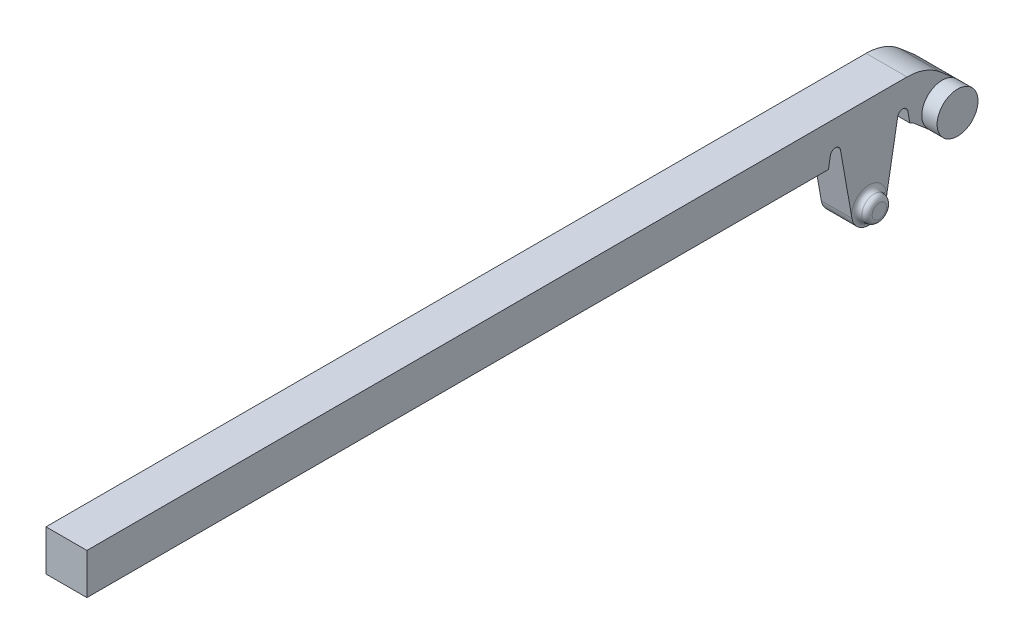
ISO-10303-21;
HEADER;
FILE_DESCRIPTION(('STEP AP214'),'2;1');
FILE_NAME('part.step','',(''),(''),'','','');
FILE_SCHEMA(('AUTOMOTIVE_DESIGN { 1 0 10303 214 1 1 1 1 }'));
ENDSEC;
DATA;
#1=APPLICATION_CONTEXT('core data for automotive mechanical design processes');
#2=APPLICATION_PROTOCOL_DEFINITION('international standard','automotive_design',2000,#1);
#3=PRODUCT_CONTEXT('',#1,'mechanical');
#4=PRODUCT('Part','Part','',(#3));
#5=PRODUCT_RELATED_PRODUCT_CATEGORY('part','',(#4));
#6=PRODUCT_DEFINITION_FORMATION('','',#4);
#7=PRODUCT_DEFINITION_CONTEXT('part definition',#1,'design');
#8=PRODUCT_DEFINITION('design','',#6,#7);
#9=PRODUCT_DEFINITION_SHAPE('','',#8);
#10=(LENGTH_UNIT() NAMED_UNIT(*) SI_UNIT(.MILLI.,.METRE.));
#11=(NAMED_UNIT(*) PLANE_ANGLE_UNIT() SI_UNIT($,.RADIAN.));
#12=(NAMED_UNIT(*) SI_UNIT($,.STERADIAN.) SOLID_ANGLE_UNIT());
#13=UNCERTAINTY_MEASURE_WITH_UNIT(LENGTH_MEASURE(1.E-05),#10,'distance_accuracy_value','');
#14=(GEOMETRIC_REPRESENTATION_CONTEXT(3) GLOBAL_UNCERTAINTY_ASSIGNED_CONTEXT((#13)) GLOBAL_UNIT_ASSIGNED_CONTEXT((#10,
#11,#12)) REPRESENTATION_CONTEXT('',''));
#15=CARTESIAN_POINT('',(0.,0.,0.));
#16=DIRECTION('',(0.,0.,1.));
#17=DIRECTION('',(1.,0.,0.));
#18=AXIS2_PLACEMENT_3D('',#15,#16,#17);
#19=CARTESIAN_POINT('',(28.25,4.75,-19.2260630484056));
#20=DIRECTION('',(-1.,0.,0.));
#21=DIRECTION('',(0.,0.,1.));
#22=AXIS2_PLACEMENT_3D('',#19,#20,#21);
#23=PLANE('',#22);
#24=DIRECTION('',(0.,-0.984807753012209,-0.173648177666924));
#25=VECTOR('',#24,1.);
#26=CARTESIAN_POINT('',(28.25,4.75,-14.346069928126));
#27=LINE('',#26,#25);
#28=CARTESIAN_POINT('',(28.25,5.29341204441673,-14.2502517230534));
#29=VERTEX_POINT('',#28);
#30=CARTESIAN_POINT('',(28.25,2.10239904898312,-14.8129134099396));
#31=VERTEX_POINT('',#30);
#32=EDGE_CURVE('E235',#29,#31,#27,.T.);
#33=ORIENTED_EDGE('',*,*,#32,.T.);
#34=CARTESIAN_POINT('',(28.25,2.25,-15.65));
#35=DIRECTION('',(-1.,0.,0.));
#36=DIRECTION('',(0.,0.,1.));
#37=AXIS2_PLACEMENT_3D('',#34,#35,#36);
#38=CIRCLE('',#37,0.85);
#39=CARTESIAN_POINT('',(28.25,2.10239904898312,-16.4870865900604));
#40=VERTEX_POINT('',#39);
#41=EDGE_CURVE('E167',#31,#40,#38,.T.);
#42=ORIENTED_EDGE('',*,*,#41,.T.);
#43=DIRECTION('',(0.,0.984807753012209,-0.173648177666924));
#44=VECTOR('',#43,1.);
#45=CARTESIAN_POINT('',(28.25,2.10239904898312,-16.4870865900604));
#46=LINE('',#45,#44);
#47=CARTESIAN_POINT('',(28.25,5.29341204441673,-17.0497482769466));
#48=VERTEX_POINT('',#47);
#49=EDGE_CURVE('E223',#40,#48,#46,.T.);
#50=ORIENTED_EDGE('',*,*,#49,.T.);
#51=CARTESIAN_POINT('',(28.25,5.25,-17.2959502151997));
#52=DIRECTION('',(1.,0.,0.));
#53=DIRECTION('',(0.,0.,-1.));
#54=AXIS2_PLACEMENT_3D('',#51,#52,#53);
#55=CIRCLE('',#54,0.250000000000004);
#56=CARTESIAN_POINT('',(28.25,5.29341204441673,-17.5421521534528));
#57=VERTEX_POINT('',#56);
#58=EDGE_CURVE('E359',#57,#48,#55,.T.);
#59=ORIENTED_EDGE('',*,*,#58,.F.);
#60=DIRECTION('',(0.,0.984807753012209,0.173648177666924));
#61=VECTOR('',#60,1.);
#62=CARTESIAN_POINT('',(28.25,5.29341204441673,-17.5421521534528));
#63=LINE('',#62,#61);
#64=CARTESIAN_POINT('',(28.25,4.73082718370005,-17.6413510433352));
#65=VERTEX_POINT('',#64);
#66=EDGE_CURVE('E177',#65,#57,#63,.T.);
#67=ORIENTED_EDGE('',*,*,#66,.F.);
#68=CARTESIAN_POINT('',(28.25,4.25,-17.5042189193997));
#69=DIRECTION('',(-1.,0.,0.));
#70=DIRECTION('',(0.,0.,1.));
#71=AXIS2_PLACEMENT_3D('',#68,#69,#70);
#72=CIRCLE('',#71,0.5);
#73=CARTESIAN_POINT('',(28.25,4.62969111772034,-17.8295413058477));
#74=VERTEX_POINT('',#73);
#75=EDGE_CURVE('E303',#65,#74,#72,.T.);
#76=ORIENTED_EDGE('',*,*,#75,.T.);
#77=DIRECTION('',(0.,0.650644772896171,0.759382235440684));
#78=VECTOR('',#77,1.);
#79=CARTESIAN_POINT('',(28.25,3.99061776455932,-18.5754182755094));
#80=LINE('',#79,#78);
#81=CARTESIAN_POINT('',(28.25,3.99061776455932,-18.5754182755094));
#82=VERTEX_POINT('',#81);
#83=EDGE_CURVE('E243',#82,#74,#80,.T.);
#84=ORIENTED_EDGE('',*,*,#83,.F.);
#85=CARTESIAN_POINT('',(28.25,4.75,-19.2260630484056));
#86=DIRECTION('',(-1.,0.,0.));
#87=DIRECTION('',(0.,0.,1.));
#88=AXIS2_PLACEMENT_3D('',#85,#86,#87);
#89=CIRCLE('',#88,1.);
#90=CARTESIAN_POINT('',(28.25,5.50938223544068,-19.8767078213017));
#91=VERTEX_POINT('',#90);
#92=EDGE_CURVE('E279',#82,#91,#89,.T.);
#93=ORIENTED_EDGE('',*,*,#92,.T.);
#94=DIRECTION('',(0.,-0.650644772896172,-0.759382235440683));
#95=VECTOR('',#94,1.);
#96=CARTESIAN_POINT('',(28.25,5.50938223544068,-19.8767078213017));
#97=LINE('',#96,#95);
#98=CARTESIAN_POINT('',(28.25,6.1484555886017,-19.1308308516401));
#99=VERTEX_POINT('',#98);
#100=EDGE_CURVE('E249',#99,#91,#97,.T.);
#101=ORIENTED_EDGE('',*,*,#100,.F.);
#102=CARTESIAN_POINT('',(28.25,4.25,-17.5042189193997));
#103=DIRECTION('',(-1.,0.,0.));
#104=DIRECTION('',(0.,0.,1.));
#105=AXIS2_PLACEMENT_3D('',#102,#103,#104);
#106=CIRCLE('',#105,2.5);
#107=CARTESIAN_POINT('',(28.25,6.75,-17.5042189193997));
#108=VERTEX_POINT('',#107);
#109=EDGE_CURVE('E295',#99,#108,#106,.F.);
#110=ORIENTED_EDGE('',*,*,#109,.T.);
#111=DIRECTION('',(0.,0.,-1.));
#112=VECTOR('',#111,1.);
#113=CARTESIAN_POINT('',(28.25,6.75,22.6));
#114=LINE('',#113,#112);
#115=CARTESIAN_POINT('',(28.25,6.75,22.6));
#116=VERTEX_POINT('',#115);
#117=EDGE_CURVE('E266',#116,#108,#114,.T.);
#118=ORIENTED_EDGE('',*,*,#117,.F.);
#119=DIRECTION('',(0.,1.,0.));
#120=VECTOR('',#119,1.);
#121=CARTESIAN_POINT('',(28.25,4.75,22.6));
#122=LINE('',#121,#120);
#123=CARTESIAN_POINT('',(28.25,4.75,22.6));
#124=VERTEX_POINT('',#123);
#125=EDGE_CURVE('E264',#124,#116,#122,.T.);
#126=ORIENTED_EDGE('',*,*,#125,.F.);
#127=DIRECTION('',(0.,0.,1.));
#128=VECTOR('',#127,1.);
#129=CARTESIAN_POINT('',(28.25,4.75,-17.6891260873219));
#130=LINE('',#129,#128);
#131=CARTESIAN_POINT('',(28.25,4.75,-13.6620296414746));
#132=VERTEX_POINT('',#131);
#133=EDGE_CURVE('E262',#132,#124,#130,.T.);
#134=ORIENTED_EDGE('',*,*,#133,.F.);
#135=DIRECTION('',(0.,-0.984807753012209,0.173648177666923));
#136=VECTOR('',#135,1.);
#137=CARTESIAN_POINT('',(28.25,5.29341204441673,-13.7578478465473));
#138=LINE('',#137,#136);
#139=CARTESIAN_POINT('',(28.25,5.29341204441673,-13.7578478465473));
#140=VERTEX_POINT('',#139);
#141=EDGE_CURVE('E369',#140,#132,#138,.T.);
#142=ORIENTED_EDGE('',*,*,#141,.F.);
#143=CARTESIAN_POINT('',(28.25,5.25,-14.0040497848003));
#144=DIRECTION('',(1.,0.,0.));
#145=DIRECTION('',(0.,0.,1.));
#146=AXIS2_PLACEMENT_3D('',#143,#144,#145);
#147=CIRCLE('',#146,0.250000000000004);
#148=EDGE_CURVE('E367',#29,#140,#147,.T.);
#149=ORIENTED_EDGE('',*,*,#148,.F.);
#150=EDGE_LOOP('',(#33,#42,#50,#59,#67,#76,#84,#93,#101,#110,#118,#126,#134,#142,#149));
#151=FACE_BOUND('',#150,.T.);
#152=ADVANCED_FACE('F35',(#151),#23,.F.);
#153=CARTESIAN_POINT('',(26.25,4.75,-19.2260630484056));
#154=DIRECTION('',(-1.,0.,0.));
#155=DIRECTION('',(0.,0.,1.));
#156=AXIS2_PLACEMENT_3D('',#153,#154,#155);
#157=PLANE('',#156);
#158=CARTESIAN_POINT('',(26.25,5.25,-17.2959502151997));
#159=DIRECTION('',(1.,0.,0.));
#160=DIRECTION('',(0.,0.,-1.));
#161=AXIS2_PLACEMENT_3D('',#158,#159,#160);
#162=CIRCLE('',#161,0.250000000000004);
#163=CARTESIAN_POINT('',(26.25,5.5,-17.2959502151997));
#164=VERTEX_POINT('',#163);
#165=CARTESIAN_POINT('',(26.25,5.29341204441673,-17.5421521534528));
#166=VERTEX_POINT('',#165);
#167=EDGE_CURVE('E161',#164,#166,#162,.F.);
#168=ORIENTED_EDGE('',*,*,#167,.F.);
#169=DIRECTION('',(0.,0.,1.));
#170=VECTOR('',#169,1.);
#171=CARTESIAN_POINT('',(26.25,5.5,-19.2260630484056));
#172=LINE('',#171,#170);
#173=CARTESIAN_POINT('',(26.25,5.50000000000001,-14.0040497848003));
#174=VERTEX_POINT('',#173);
#175=EDGE_CURVE('E170',#164,#174,#172,.T.);
#176=ORIENTED_EDGE('',*,*,#175,.T.);
#177=CARTESIAN_POINT('',(26.25,5.25,-14.0040497848003));
#178=DIRECTION('',(1.,0.,0.));
#179=DIRECTION('',(0.,0.,-1.));
#180=AXIS2_PLACEMENT_3D('',#177,#178,#179);
#181=CIRCLE('',#180,0.250000000000004);
#182=CARTESIAN_POINT('',(26.25,5.29341204441673,-13.7578478465472));
#183=VERTEX_POINT('',#182);
#184=EDGE_CURVE('E186',#183,#174,#181,.F.);
#185=ORIENTED_EDGE('',*,*,#184,.F.);
#186=DIRECTION('',(0.,0.984807753012209,-0.173648177666924));
#187=VECTOR('',#186,1.);
#188=CARTESIAN_POINT('',(26.25,5.70150575165363,-13.8298057777905));
#189=LINE('',#188,#187);
#190=CARTESIAN_POINT('',(26.25,4.75,-13.6620296414746));
#191=VERTEX_POINT('',#190);
#192=EDGE_CURVE('E307',#191,#183,#189,.T.);
#193=ORIENTED_EDGE('',*,*,#192,.F.);
#194=DIRECTION('',(0.,0.,1.));
#195=VECTOR('',#194,1.);
#196=CARTESIAN_POINT('',(26.25,4.75,-17.6891260873219));
#197=LINE('',#196,#195);
#198=CARTESIAN_POINT('',(26.25,4.75,22.6));
#199=VERTEX_POINT('',#198);
#200=EDGE_CURVE('E252',#191,#199,#197,.T.);
#201=ORIENTED_EDGE('',*,*,#200,.T.);
#202=DIRECTION('',(0.,1.,0.));
#203=VECTOR('',#202,1.);
#204=CARTESIAN_POINT('',(26.25,4.75,22.6));
#205=LINE('',#204,#203);
#206=CARTESIAN_POINT('',(26.25,6.75,22.6));
#207=VERTEX_POINT('',#206);
#208=EDGE_CURVE('E254',#199,#207,#205,.T.);
#209=ORIENTED_EDGE('',*,*,#208,.T.);
#210=DIRECTION('',(0.,0.,-1.));
#211=VECTOR('',#210,1.);
#212=CARTESIAN_POINT('',(26.25,6.75,22.6));
#213=LINE('',#212,#211);
#214=CARTESIAN_POINT('',(26.25,6.75,-17.5042189193997));
#215=VERTEX_POINT('',#214);
#216=EDGE_CURVE('E256',#207,#215,#213,.T.);
#217=ORIENTED_EDGE('',*,*,#216,.T.);
#218=CARTESIAN_POINT('',(26.25,4.25,-17.5042189193997));
#219=DIRECTION('',(-1.,0.,0.));
#220=DIRECTION('',(0.,0.,1.));
#221=AXIS2_PLACEMENT_3D('',#218,#219,#220);
#222=CIRCLE('',#221,2.5);
#223=CARTESIAN_POINT('',(26.25,6.1484555886017,-19.1308308516401));
#224=VERTEX_POINT('',#223);
#225=EDGE_CURVE('E299',#215,#224,#222,.T.);
#226=ORIENTED_EDGE('',*,*,#225,.T.);
#227=DIRECTION('',(0.,-0.650644772896172,-0.759382235440683));
#228=VECTOR('',#227,1.);
#229=CARTESIAN_POINT('',(26.25,5.50938223544068,-19.8767078213017));
#230=LINE('',#229,#228);
#231=CARTESIAN_POINT('',(26.25,5.50938223544068,-19.8767078213017));
#232=VERTEX_POINT('',#231);
#233=EDGE_CURVE('E259',#224,#232,#230,.T.);
#234=ORIENTED_EDGE('',*,*,#233,.T.);
#235=CARTESIAN_POINT('',(26.25,4.75,-19.2260630484056));
#236=DIRECTION('',(-1.,0.,0.));
#237=DIRECTION('',(0.,0.,1.));
#238=AXIS2_PLACEMENT_3D('',#235,#236,#237);
#239=CIRCLE('',#238,1.);
#240=CARTESIAN_POINT('',(26.25,3.99061776455932,-18.5754182755094));
#241=VERTEX_POINT('',#240);
#242=EDGE_CURVE('E245',#232,#241,#239,.T.);
#243=ORIENTED_EDGE('',*,*,#242,.T.);
#244=DIRECTION('',(0.,0.650644772896171,0.759382235440684));
#245=VECTOR('',#244,1.);
#246=CARTESIAN_POINT('',(26.25,3.99061776455932,-18.5754182755094));
#247=LINE('',#246,#245);
#248=CARTESIAN_POINT('',(26.25,4.62969111772034,-17.8295413058477));
#249=VERTEX_POINT('',#248);
#250=EDGE_CURVE('E248',#241,#249,#247,.T.);
#251=ORIENTED_EDGE('',*,*,#250,.T.);
#252=CARTESIAN_POINT('',(26.25,4.25,-17.5042189193997));
#253=DIRECTION('',(-1.,0.,0.));
#254=DIRECTION('',(0.,0.,1.));
#255=AXIS2_PLACEMENT_3D('',#252,#253,#254);
#256=CIRCLE('',#255,0.5);
#257=CARTESIAN_POINT('',(26.25,4.73082718370005,-17.6413510433352));
#258=VERTEX_POINT('',#257);
#259=EDGE_CURVE('E305',#249,#258,#256,.F.);
#260=ORIENTED_EDGE('',*,*,#259,.T.);
#261=DIRECTION('',(0.,-0.984807753012209,-0.173648177666924));
#262=VECTOR('',#261,1.);
#263=CARTESIAN_POINT('',(26.25,5.29341204441673,-17.5421521534528));
#264=LINE('',#263,#262);
#265=EDGE_CURVE('E182',#258,#166,#264,.F.);
#266=ORIENTED_EDGE('',*,*,#265,.T.);
#267=EDGE_LOOP('',(#168,#176,#185,#193,#201,#209,#217,#226,#234,#243,#251,#260,#266));
#268=FACE_BOUND('',#267,.T.);
#269=ADVANCED_FACE('F180',(#268),#157,.T.);
#270=CARTESIAN_POINT('',(26.249975,5.25,-14.0040497848003));
#271=DIRECTION('',(1.,0.,0.));
#272=DIRECTION('',(0.,0.,-1.));
#273=AXIS2_PLACEMENT_3D('',#270,#271,#272);
#274=CYLINDRICAL_SURFACE('',#273,0.250000000000004);
#275=DIRECTION('',(1.,0.,0.));
#276=VECTOR('',#275,1.);
#277=CARTESIAN_POINT('',(26.249975,5.50000000000001,-14.0040497848003));
#278=LINE('',#277,#276);
#279=CARTESIAN_POINT('',(26.5,5.50000000000001,-14.0040497848003));
#280=VERTEX_POINT('',#279);
#281=EDGE_CURVE('E173',#174,#280,#278,.T.);
#282=ORIENTED_EDGE('',*,*,#281,.T.);
#283=CARTESIAN_POINT('',(26.5,5.25,-14.0040497848003));
#284=DIRECTION('',(0.707106781186548,0.,0.707106781186547));
#285=DIRECTION('',(0.707106781186547,0.,-0.707106781186548));
#286=AXIS2_PLACEMENT_3D('',#283,#284,#285);
#287=ELLIPSE('',#286,0.353553390593277,0.250000000000002);
#288=CARTESIAN_POINT('',(26.746201938253,5.29341204441673,-14.2502517230534));
#289=VERTEX_POINT('',#288);
#290=EDGE_CURVE('E43',#280,#289,#287,.F.);
#291=ORIENTED_EDGE('',*,*,#290,.T.);
#292=DIRECTION('',(1.,0.,0.));
#293=VECTOR('',#292,1.);
#294=CARTESIAN_POINT('',(26.249975,5.29341204441673,-14.2502517230534));
#295=LINE('',#294,#293);
#296=EDGE_CURVE('E49',#289,#29,#295,.T.);
#297=ORIENTED_EDGE('',*,*,#296,.T.);
#298=ORIENTED_EDGE('',*,*,#148,.T.);
#299=DIRECTION('',(1.,0.,0.));
#300=VECTOR('',#299,1.);
#301=CARTESIAN_POINT('',(26.249975,5.29341204441673,-13.7578478465473));
#302=LINE('',#301,#300);
#303=EDGE_CURVE('E310',#183,#140,#302,.T.);
#304=ORIENTED_EDGE('',*,*,#303,.F.);
#305=ORIENTED_EDGE('',*,*,#184,.T.);
#306=EDGE_LOOP('',(#282,#291,#297,#298,#304,#305));
#307=FACE_BOUND('',#306,.T.);
#308=ADVANCED_FACE('F207',(#307),#274,.F.);
#309=CARTESIAN_POINT('',(28.25,4.75,-19.2260630484056));
#310=DIRECTION('',(1.,0.,0.));
#311=DIRECTION('',(0.,0.,-1.));
#312=AXIS2_PLACEMENT_3D('',#309,#310,#311);
#313=CYLINDRICAL_SURFACE('',#312,1.);
#314=ORIENTED_EDGE('',*,*,#92,.F.);
#315=DIRECTION('',(1.,0.,0.));
#316=VECTOR('',#315,1.);
#317=CARTESIAN_POINT('',(26.25,3.99061776455932,-18.5754182755094));
#318=LINE('',#317,#316);
#319=EDGE_CURVE('E275',#241,#82,#318,.T.);
#320=ORIENTED_EDGE('',*,*,#319,.F.);
#321=ORIENTED_EDGE('',*,*,#242,.F.);
#322=DIRECTION('',(1.,0.,0.));
#323=VECTOR('',#322,1.);
#324=CARTESIAN_POINT('',(26.25,5.50938223544068,-19.8767078213017));
#325=LINE('',#324,#323);
#326=EDGE_CURVE('E261',#232,#91,#325,.T.);
#327=ORIENTED_EDGE('',*,*,#326,.T.);
#328=EDGE_LOOP('',(#314,#320,#321,#327));
#329=FACE_BOUND('',#328,.T.);
#330=CARTESIAN_POINT('',(29.,4.75,-19.2260630484056));
#331=DIRECTION('',(-1.,0.,0.));
#332=DIRECTION('',(0.,0.,1.));
#333=AXIS2_PLACEMENT_3D('',#330,#331,#332);
#334=CIRCLE('',#333,1.);
#335=CARTESIAN_POINT('',(29.,4.75,-18.2260630484056));
#336=VERTEX_POINT('',#335);
#337=EDGE_CURVE('E276',#336,#336,#334,.T.);
#338=ORIENTED_EDGE('',*,*,#337,.T.);
#339=EDGE_LOOP('',(#338));
#340=FACE_BOUND('',#339,.T.);
#341=ADVANCED_FACE('F346',(#329,#340),#313,.T.);
#342=CARTESIAN_POINT('',(29.,4.75,-19.2260630484056));
#343=DIRECTION('',(-1.,0.,0.));
#344=DIRECTION('',(0.,0.,1.));
#345=AXIS2_PLACEMENT_3D('',#342,#343,#344);
#346=PLANE('',#345);
#347=ORIENTED_EDGE('',*,*,#337,.F.);
#348=EDGE_LOOP('',(#347));
#349=FACE_BOUND('',#348,.T.);
#350=ADVANCED_FACE('F438',(#349),#346,.F.);
#351=CARTESIAN_POINT('',(26.25,3.99061776455932,-18.5754182755094));
#352=DIRECTION('',(0.,0.759382235440684,-0.650644772896171));
#353=DIRECTION('',(0.,0.650644772896171,0.759382235440684));
#354=AXIS2_PLACEMENT_3D('',#351,#352,#353);
#355=PLANE('',#354);
#356=ORIENTED_EDGE('',*,*,#83,.T.);
#357=DIRECTION('',(1.,0.,0.));
#358=VECTOR('',#357,1.);
#359=CARTESIAN_POINT('',(26.25,4.62969111772034,-17.8295413058477));
#360=LINE('',#359,#358);
#361=EDGE_CURVE('E301',#74,#249,#360,.F.);
#362=ORIENTED_EDGE('',*,*,#361,.T.);
#363=ORIENTED_EDGE('',*,*,#250,.F.);
#364=ORIENTED_EDGE('',*,*,#319,.T.);
#365=EDGE_LOOP('',(#356,#362,#363,#364));
#366=FACE_BOUND('',#365,.T.);
#367=ADVANCED_FACE('F441',(#366),#355,.F.);
#368=CARTESIAN_POINT('',(26.25,4.75,-17.6891260873219));
#369=DIRECTION('',(0.,1.,0.));
#370=DIRECTION('',(0.,0.,1.));
#371=AXIS2_PLACEMENT_3D('',#368,#369,#370);
#372=PLANE('',#371);
#373=ORIENTED_EDGE('',*,*,#200,.F.);
#374=DIRECTION('',(1.,0.,0.));
#375=VECTOR('',#374,1.);
#376=CARTESIAN_POINT('',(26.249975,4.75,-13.6620296414746));
#377=LINE('',#376,#375);
#378=EDGE_CURVE('E318',#191,#132,#377,.T.);
#379=ORIENTED_EDGE('',*,*,#378,.T.);
#380=ORIENTED_EDGE('',*,*,#133,.T.);
#381=DIRECTION('',(1.,0.,0.));
#382=VECTOR('',#381,1.);
#383=CARTESIAN_POINT('',(26.25,4.75,22.6));
#384=LINE('',#383,#382);
#385=EDGE_CURVE('E272',#199,#124,#384,.T.);
#386=ORIENTED_EDGE('',*,*,#385,.F.);
#387=EDGE_LOOP('',(#373,#379,#380,#386));
#388=FACE_BOUND('',#387,.T.);
#389=ADVANCED_FACE('F317',(#388),#372,.F.);
#390=CARTESIAN_POINT('',(26.25,4.75,22.6));
#391=DIRECTION('',(0.,0.,-1.));
#392=DIRECTION('',(0.,1.,0.));
#393=AXIS2_PLACEMENT_3D('',#390,#391,#392);
#394=PLANE('',#393);
#395=ORIENTED_EDGE('',*,*,#125,.T.);
#396=DIRECTION('',(1.,0.,0.));
#397=VECTOR('',#396,1.);
#398=CARTESIAN_POINT('',(26.25,6.75,22.6));
#399=LINE('',#398,#397);
#400=EDGE_CURVE('E269',#207,#116,#399,.T.);
#401=ORIENTED_EDGE('',*,*,#400,.F.);
#402=ORIENTED_EDGE('',*,*,#208,.F.);
#403=ORIENTED_EDGE('',*,*,#385,.T.);
#404=EDGE_LOOP('',(#395,#401,#402,#403));
#405=FACE_BOUND('',#404,.T.);
#406=ADVANCED_FACE('F324',(#405),#394,.F.);
#407=CARTESIAN_POINT('',(26.25,6.75,22.6));
#408=DIRECTION('',(0.,-1.,0.));
#409=DIRECTION('',(0.,0.,-1.));
#410=AXIS2_PLACEMENT_3D('',#407,#408,#409);
#411=PLANE('',#410);
#412=ORIENTED_EDGE('',*,*,#117,.T.);
#413=DIRECTION('',(1.,0.,0.));
#414=VECTOR('',#413,1.);
#415=CARTESIAN_POINT('',(26.25,6.75,-17.5042189193997));
#416=LINE('',#415,#414);
#417=EDGE_CURVE('E297',#108,#215,#416,.F.);
#418=ORIENTED_EDGE('',*,*,#417,.T.);
#419=ORIENTED_EDGE('',*,*,#216,.F.);
#420=ORIENTED_EDGE('',*,*,#400,.T.);
#421=EDGE_LOOP('',(#412,#418,#419,#420));
#422=FACE_BOUND('',#421,.T.);
#423=ADVANCED_FACE('F374',(#422),#411,.F.);
#424=CARTESIAN_POINT('',(26.25,5.50938223544068,-19.8767078213017));
#425=DIRECTION('',(0.,-0.759382235440683,0.650644772896172));
#426=DIRECTION('',(0.,-0.650644772896172,-0.759382235440683));
#427=AXIS2_PLACEMENT_3D('',#424,#425,#426);
#428=PLANE('',#427);
#429=ORIENTED_EDGE('',*,*,#233,.F.);
#430=DIRECTION('',(1.,0.,0.));
#431=VECTOR('',#430,1.);
#432=CARTESIAN_POINT('',(26.25,6.1484555886017,-19.1308308516401));
#433=LINE('',#432,#431);
#434=EDGE_CURVE('E284',#224,#99,#433,.T.);
#435=ORIENTED_EDGE('',*,*,#434,.T.);
#436=ORIENTED_EDGE('',*,*,#100,.T.);
#437=ORIENTED_EDGE('',*,*,#326,.F.);
#438=EDGE_LOOP('',(#429,#435,#436,#437));
#439=FACE_BOUND('',#438,.T.);
#440=ADVANCED_FACE('F335',(#439),#428,.F.);
#441=CARTESIAN_POINT('',(26.25,4.25,-17.5042189193997));
#442=DIRECTION('',(1.,0.,0.));
#443=DIRECTION('',(0.,0.,-1.));
#444=AXIS2_PLACEMENT_3D('',#441,#442,#443);
#445=CYLINDRICAL_SURFACE('',#444,2.5);
#446=ORIENTED_EDGE('',*,*,#225,.F.);
#447=ORIENTED_EDGE('',*,*,#417,.F.);
#448=ORIENTED_EDGE('',*,*,#109,.F.);
#449=ORIENTED_EDGE('',*,*,#434,.F.);
#450=EDGE_LOOP('',(#446,#447,#448,#449));
#451=FACE_BOUND('',#450,.T.);
#452=ADVANCED_FACE('F332',(#451),#445,.T.);
#453=CARTESIAN_POINT('',(26.25,4.25,-17.5042189193997));
#454=DIRECTION('',(-1.,0.,0.));
#455=DIRECTION('',(0.,0.,1.));
#456=AXIS2_PLACEMENT_3D('',#453,#454,#455);
#457=CYLINDRICAL_SURFACE('',#456,0.5);
#458=ORIENTED_EDGE('',*,*,#75,.F.);
#459=DIRECTION('',(-1.,0.,0.));
#460=VECTOR('',#459,1.);
#461=CARTESIAN_POINT('',(26.25,4.73082718370005,-17.6413510433352));
#462=LINE('',#461,#460);
#463=EDGE_CURVE('E183',#65,#258,#462,.T.);
#464=ORIENTED_EDGE('',*,*,#463,.T.);
#465=ORIENTED_EDGE('',*,*,#259,.F.);
#466=ORIENTED_EDGE('',*,*,#361,.F.);
#467=EDGE_LOOP('',(#458,#464,#465,#466));
#468=FACE_BOUND('',#467,.T.);
#469=ADVANCED_FACE('F353',(#468),#457,.F.);
#470=CARTESIAN_POINT('',(26.75,2.10239904898312,-16.4870865900604));
#471=DIRECTION('',(0.,-0.173648177666924,-0.984807753012209));
#472=DIRECTION('',(0.,0.984807753012209,-0.173648177666924));
#473=AXIS2_PLACEMENT_3D('',#470,#471,#472);
#474=PLANE('',#473);
#475=DIRECTION('',(0.,0.984807753012209,-0.173648177666924));
#476=VECTOR('',#475,1.);
#477=CARTESIAN_POINT('',(26.75,2.10239904898312,-16.4870865900604));
#478=LINE('',#477,#476);
#479=CARTESIAN_POINT('',(26.75,2.10239904898312,-16.4870865900604));
#480=VERTEX_POINT('',#479);
#481=CARTESIAN_POINT('',(26.75,5.25,-17.0420935622283));
#482=VERTEX_POINT('',#481);
#483=EDGE_CURVE('E225',#480,#482,#478,.T.);
#484=ORIENTED_EDGE('',*,*,#483,.T.);
#485=CARTESIAN_POINT('',(26.5,5.25,-17.0420935622283));
#486=DIRECTION('',(0.,-0.173648177666924,-0.984807753012209));
#487=DIRECTION('',(0.,0.984807753012209,-0.173648177666924));
#488=AXIS2_PLACEMENT_3D('',#485,#486,#487);
#489=ELLIPSE('',#488,0.253856652971436,0.25);
#490=CARTESIAN_POINT('',(26.746201938253,5.29341204441673,-17.0497482769466));
#491=VERTEX_POINT('',#490);
#492=EDGE_CURVE('E202',#482,#491,#489,.F.);
#493=ORIENTED_EDGE('',*,*,#492,.T.);
#494=DIRECTION('',(1.,0.,0.));
#495=VECTOR('',#494,1.);
#496=CARTESIAN_POINT('',(26.249975,5.29341204441673,-17.0497482769466));
#497=LINE('',#496,#495);
#498=EDGE_CURVE('E57',#491,#48,#497,.T.);
#499=ORIENTED_EDGE('',*,*,#498,.T.);
#500=ORIENTED_EDGE('',*,*,#49,.F.);
#501=DIRECTION('',(1.,0.,0.));
#502=VECTOR('',#501,1.);
#503=CARTESIAN_POINT('',(26.75,2.10239904898312,-16.4870865900604));
#504=LINE('',#503,#502);
#505=EDGE_CURVE('E240',#480,#40,#504,.T.);
#506=ORIENTED_EDGE('',*,*,#505,.F.);
#507=EDGE_LOOP('',(#484,#493,#499,#500,#506));
#508=FACE_BOUND('',#507,.T.);
#509=ADVANCED_FACE('F395',(#508),#474,.T.);
#510=CARTESIAN_POINT('',(26.75,2.25,-15.65));
#511=DIRECTION('',(1.,0.,0.));
#512=DIRECTION('',(0.,0.,-1.));
#513=AXIS2_PLACEMENT_3D('',#510,#511,#512);
#514=CYLINDRICAL_SURFACE('',#513,0.849999999999999);
#515=CARTESIAN_POINT('',(28.25,2.25,-15.65));
#516=DIRECTION('',(1.,0.,0.));
#517=DIRECTION('',(0.,0.,-1.));
#518=AXIS2_PLACEMENT_3D('',#515,#516,#517);
#519=CIRCLE('',#518,0.849999999999999);
#520=EDGE_CURVE('E228',#31,#40,#519,.T.);
#521=ORIENTED_EDGE('',*,*,#520,.F.);
#522=DIRECTION('',(1.,0.,0.));
#523=VECTOR('',#522,1.);
#524=CARTESIAN_POINT('',(26.75,2.10239904898312,-14.8129134099396));
#525=LINE('',#524,#523);
#526=CARTESIAN_POINT('',(26.75,2.10239904898312,-14.8129134099396));
#527=VERTEX_POINT('',#526);
#528=EDGE_CURVE('E234',#527,#31,#525,.T.);
#529=ORIENTED_EDGE('',*,*,#528,.F.);
#530=CARTESIAN_POINT('',(26.75,2.25,-15.65));
#531=DIRECTION('',(1.,0.,0.));
#532=DIRECTION('',(0.,0.,-1.));
#533=AXIS2_PLACEMENT_3D('',#530,#531,#532);
#534=CIRCLE('',#533,0.849999999999999);
#535=EDGE_CURVE('E222',#527,#480,#534,.T.);
#536=ORIENTED_EDGE('',*,*,#535,.T.);
#537=ORIENTED_EDGE('',*,*,#505,.T.);
#538=EDGE_LOOP('',(#521,#529,#536,#537));
#539=FACE_BOUND('',#538,.T.);
#540=ADVANCED_FACE('F392',(#539),#514,.T.);
#541=CARTESIAN_POINT('',(26.75,4.75,-14.346069928126));
#542=DIRECTION('',(0.,-0.173648177666924,0.984807753012209));
#543=DIRECTION('',(0.,-0.984807753012209,-0.173648177666924));
#544=AXIS2_PLACEMENT_3D('',#541,#542,#543);
#545=PLANE('',#544);
#546=ORIENTED_EDGE('',*,*,#296,.F.);
#547=CARTESIAN_POINT('',(26.5,5.25,-14.2579064377717));
#548=DIRECTION('',(0.,-0.173648177666924,0.984807753012209));
#549=DIRECTION('',(0.,-0.984807753012209,-0.173648177666924));
#550=AXIS2_PLACEMENT_3D('',#547,#548,#549);
#551=ELLIPSE('',#550,0.253856652971436,0.25);
#552=CARTESIAN_POINT('',(26.75,5.25,-14.2579064377717));
#553=VERTEX_POINT('',#552);
#554=EDGE_CURVE('E11',#289,#553,#551,.F.);
#555=ORIENTED_EDGE('',*,*,#554,.T.);
#556=DIRECTION('',(0.,-0.984807753012209,-0.173648177666924));
#557=VECTOR('',#556,1.);
#558=CARTESIAN_POINT('',(26.75,4.75,-14.346069928126));
#559=LINE('',#558,#557);
#560=EDGE_CURVE('E214',#553,#527,#559,.T.);
#561=ORIENTED_EDGE('',*,*,#560,.T.);
#562=ORIENTED_EDGE('',*,*,#528,.T.);
#563=ORIENTED_EDGE('',*,*,#32,.F.);
#564=EDGE_LOOP('',(#546,#555,#561,#562,#563));
#565=FACE_BOUND('',#564,.T.);
#566=ADVANCED_FACE('F212',(#565),#545,.T.);
#567=CARTESIAN_POINT('',(26.75,2.25,-15.65));
#568=DIRECTION('',(1.,0.,0.));
#569=DIRECTION('',(0.,0.,-1.));
#570=AXIS2_PLACEMENT_3D('',#567,#568,#569);
#571=PLANE('',#570);
#572=ORIENTED_EDGE('',*,*,#560,.F.);
#573=DIRECTION('',(0.,0.,-1.));
#574=VECTOR('',#573,1.);
#575=CARTESIAN_POINT('',(26.75,5.25,-15.65));
#576=LINE('',#575,#574);
#577=EDGE_CURVE('E194',#553,#482,#576,.T.);
#578=ORIENTED_EDGE('',*,*,#577,.T.);
#579=ORIENTED_EDGE('',*,*,#483,.F.);
#580=ORIENTED_EDGE('',*,*,#535,.F.);
#581=EDGE_LOOP('',(#572,#578,#579,#580));
#582=FACE_BOUND('',#581,.T.);
#583=ADVANCED_FACE('F218',(#582),#571,.F.);
#584=CARTESIAN_POINT('',(26.249975,5.29341204441673,-13.7578478465473));
#585=DIRECTION('',(0.,0.173648177666924,0.984807753012209));
#586=DIRECTION('',(0.,-0.984807753012209,0.173648177666924));
#587=AXIS2_PLACEMENT_3D('',#584,#585,#586);
#588=PLANE('',#587);
#589=ORIENTED_EDGE('',*,*,#192,.T.);
#590=ORIENTED_EDGE('',*,*,#303,.T.);
#591=ORIENTED_EDGE('',*,*,#141,.T.);
#592=ORIENTED_EDGE('',*,*,#378,.F.);
#593=EDGE_LOOP('',(#589,#590,#591,#592));
#594=FACE_BOUND('',#593,.T.);
#595=ADVANCED_FACE('F371',(#594),#588,.F.);
#596=CARTESIAN_POINT('',(26.249975,5.25,-17.2959502151997));
#597=DIRECTION('',(1.,0.,0.));
#598=DIRECTION('',(0.,0.,-1.));
#599=AXIS2_PLACEMENT_3D('',#596,#597,#598);
#600=CYLINDRICAL_SURFACE('',#599,0.250000000000004);
#601=ORIENTED_EDGE('',*,*,#498,.F.);
#602=CARTESIAN_POINT('',(26.5,5.25,-17.2959502151997));
#603=DIRECTION('',(0.707106781186547,0.,-0.707106781186548));
#604=DIRECTION('',(0.707106781186548,0.,0.707106781186547));
#605=AXIS2_PLACEMENT_3D('',#602,#603,#604);
#606=ELLIPSE('',#605,0.353553390593277,0.250000000000002);
#607=CARTESIAN_POINT('',(26.5,5.5,-17.2959502151997));
#608=VERTEX_POINT('',#607);
#609=EDGE_CURVE('E164',#491,#608,#606,.F.);
#610=ORIENTED_EDGE('',*,*,#609,.T.);
#611=DIRECTION('',(1.,0.,0.));
#612=VECTOR('',#611,1.);
#613=CARTESIAN_POINT('',(26.249975,5.5,-17.2959502151997));
#614=LINE('',#613,#612);
#615=EDGE_CURVE('E157',#608,#164,#614,.F.);
#616=ORIENTED_EDGE('',*,*,#615,.T.);
#617=ORIENTED_EDGE('',*,*,#167,.T.);
#618=DIRECTION('',(1.,0.,0.));
#619=VECTOR('',#618,1.);
#620=CARTESIAN_POINT('',(26.249975,5.29341204441673,-17.5421521534528));
#621=LINE('',#620,#619);
#622=EDGE_CURVE('E361',#166,#57,#621,.T.);
#623=ORIENTED_EDGE('',*,*,#622,.T.);
#624=ORIENTED_EDGE('',*,*,#58,.T.);
#625=EDGE_LOOP('',(#601,#610,#616,#617,#623,#624));
#626=FACE_BOUND('',#625,.T.);
#627=ADVANCED_FACE('F159',(#626),#600,.F.);
#628=CARTESIAN_POINT('',(26.249975,5.29341204441673,-17.5421521534528));
#629=DIRECTION('',(0.,0.173648177666924,-0.984807753012209));
#630=DIRECTION('',(0.,0.984807753012209,0.173648177666924));
#631=AXIS2_PLACEMENT_3D('',#628,#629,#630);
#632=PLANE('',#631);
#633=ORIENTED_EDGE('',*,*,#265,.F.);
#634=ORIENTED_EDGE('',*,*,#463,.F.);
#635=ORIENTED_EDGE('',*,*,#66,.T.);
#636=ORIENTED_EDGE('',*,*,#622,.F.);
#637=EDGE_LOOP('',(#633,#634,#635,#636));
#638=FACE_BOUND('',#637,.T.);
#639=ADVANCED_FACE('F357',(#638),#632,.F.);
#640=CARTESIAN_POINT('',(26.249975,5.5,-17.2959502151997));
#641=DIRECTION('',(0.,-1.,0.));
#642=DIRECTION('',(0.,0.,-1.));
#643=AXIS2_PLACEMENT_3D('',#640,#641,#642);
#644=PLANE('',#643);
#645=ORIENTED_EDGE('',*,*,#615,.F.);
#646=DIRECTION('',(0.,0.,-1.));
#647=VECTOR('',#646,1.);
#648=CARTESIAN_POINT('',(26.5,5.5,-17.2959502151997));
#649=LINE('',#648,#647);
#650=EDGE_CURVE('E200',#608,#280,#649,.F.);
#651=ORIENTED_EDGE('',*,*,#650,.T.);
#652=ORIENTED_EDGE('',*,*,#281,.F.);
#653=ORIENTED_EDGE('',*,*,#175,.F.);
#654=EDGE_LOOP('',(#645,#651,#652,#653));
#655=FACE_BOUND('',#654,.T.);
#656=ADVANCED_FACE('F171',(#655),#644,.T.);
#657=CARTESIAN_POINT('',(28.75,2.25,-15.65));
#658=DIRECTION('',(1.,0.,0.));
#659=DIRECTION('',(0.,0.,-1.));
#660=AXIS2_PLACEMENT_3D('',#657,#658,#659);
#661=PLANE('',#660);
#662=CARTESIAN_POINT('',(28.75,2.25,-15.65));
#663=DIRECTION('',(1.,0.,0.));
#664=DIRECTION('',(0.,0.,-1.));
#665=AXIS2_PLACEMENT_3D('',#662,#663,#664);
#666=CIRCLE('',#665,0.35);
#667=CARTESIAN_POINT('',(28.75,2.25,-16.));
#668=VERTEX_POINT('',#667);
#669=EDGE_CURVE('E191',#668,#668,#666,.T.);
#670=ORIENTED_EDGE('',*,*,#669,.T.);
#671=EDGE_LOOP('',(#670));
#672=FACE_BOUND('',#671,.T.);
#673=ADVANCED_FACE('F412',(#672),#661,.T.);
#674=CARTESIAN_POINT('',(28.5,2.25,-15.65));
#675=DIRECTION('',(1.,0.,0.));
#676=DIRECTION('',(0.,0.,-1.));
#677=AXIS2_PLACEMENT_3D('',#674,#675,#676);
#678=TOROIDAL_SURFACE('',#677,0.35,0.25);
#679=ORIENTED_EDGE('',*,*,#669,.F.);
#680=EDGE_LOOP('',(#679));
#681=FACE_BOUND('',#680,.T.);
#682=CARTESIAN_POINT('',(28.5,2.25,-15.65));
#683=DIRECTION('',(1.,0.,0.));
#684=DIRECTION('',(0.,0.,-1.));
#685=AXIS2_PLACEMENT_3D('',#682,#683,#684);
#686=CIRCLE('',#685,0.6);
#687=CARTESIAN_POINT('',(28.5,2.25,-16.25));
#688=VERTEX_POINT('',#687);
#689=EDGE_CURVE('E195',#688,#688,#686,.F.);
#690=ORIENTED_EDGE('',*,*,#689,.F.);
#691=EDGE_LOOP('',(#690));
#692=FACE_BOUND('',#691,.T.);
#693=ADVANCED_FACE('F414',(#681,#692),#678,.T.);
#694=CARTESIAN_POINT('',(28.5,2.25,-15.65));
#695=DIRECTION('',(-1.,0.,0.));
#696=DIRECTION('',(0.,0.,1.));
#697=AXIS2_PLACEMENT_3D('',#694,#695,#696);
#698=TOROIDAL_SURFACE('',#697,0.85,0.25);
#699=ORIENTED_EDGE('',*,*,#41,.F.);
#700=ORIENTED_EDGE('',*,*,#520,.T.);
#701=EDGE_LOOP('',(#699,#700));
#702=FACE_BOUND('',#701,.T.);
#703=ORIENTED_EDGE('',*,*,#689,.T.);
#704=EDGE_LOOP('',(#703));
#705=FACE_BOUND('',#704,.T.);
#706=ADVANCED_FACE('F419',(#702,#705),#698,.F.);
#707=CARTESIAN_POINT('',(26.5,5.25,-15.65));
#708=DIRECTION('',(0.,0.,-1.));
#709=DIRECTION('',(0.,1.,0.));
#710=AXIS2_PLACEMENT_3D('',#707,#708,#709);
#711=CYLINDRICAL_SURFACE('',#710,0.25);
#712=ORIENTED_EDGE('',*,*,#290,.F.);
#713=ORIENTED_EDGE('',*,*,#650,.F.);
#714=ORIENTED_EDGE('',*,*,#609,.F.);
#715=ORIENTED_EDGE('',*,*,#492,.F.);
#716=ORIENTED_EDGE('',*,*,#577,.F.);
#717=ORIENTED_EDGE('',*,*,#554,.F.);
#718=EDGE_LOOP('',(#712,#713,#714,#715,#716,#717));
#719=FACE_BOUND('',#718,.T.);
#720=ADVANCED_FACE('F37',(#719),#711,.F.);
#721=CLOSED_SHELL('',(#152,#269,#308,#341,#350,#367,#389,#406,#423,#440,#452,#469,#509,#540,
#566,#583,#595,#627,#639,#656,#673,#693,#706,#720));
#722=MANIFOLD_SOLID_BREP('B2',#721);
#723=ADVANCED_BREP_SHAPE_REPRESENTATION('',(#18,#722),#14);
#724=SHAPE_DEFINITION_REPRESENTATION(#9,#723);
ENDSEC;
END-ISO-10303-21;
